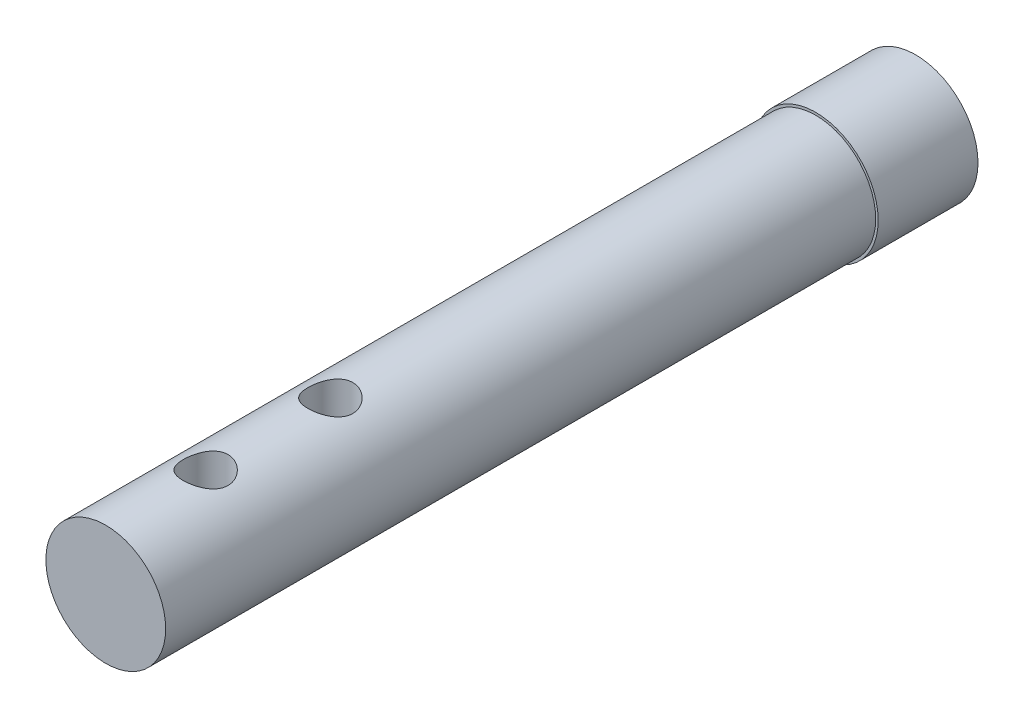
ISO-10303-21;
HEADER;
FILE_DESCRIPTION(('STEP AP214'),'2;1');
FILE_NAME('part.step','',(''),(''),'','','');
FILE_SCHEMA(('AUTOMOTIVE_DESIGN { 1 0 10303 214 1 1 1 1 }'));
ENDSEC;
DATA;
#1=APPLICATION_CONTEXT('core data for automotive mechanical design processes');
#2=APPLICATION_PROTOCOL_DEFINITION('international standard','automotive_design',2000,#1);
#3=PRODUCT_CONTEXT('',#1,'mechanical');
#4=PRODUCT('Part','Part','',(#3));
#5=PRODUCT_RELATED_PRODUCT_CATEGORY('part','',(#4));
#6=PRODUCT_DEFINITION_FORMATION('','',#4);
#7=PRODUCT_DEFINITION_CONTEXT('part definition',#1,'design');
#8=PRODUCT_DEFINITION('design','',#6,#7);
#9=PRODUCT_DEFINITION_SHAPE('','',#8);
#10=(LENGTH_UNIT() NAMED_UNIT(*) SI_UNIT(.MILLI.,.METRE.));
#11=(NAMED_UNIT(*) PLANE_ANGLE_UNIT() SI_UNIT($,.RADIAN.));
#12=(NAMED_UNIT(*) SI_UNIT($,.STERADIAN.) SOLID_ANGLE_UNIT());
#13=UNCERTAINTY_MEASURE_WITH_UNIT(LENGTH_MEASURE(1.E-05),#10,'distance_accuracy_value','');
#14=(GEOMETRIC_REPRESENTATION_CONTEXT(3) GLOBAL_UNCERTAINTY_ASSIGNED_CONTEXT((#13)) GLOBAL_UNIT_ASSIGNED_CONTEXT((#10,
#11,#12)) REPRESENTATION_CONTEXT('',''));
#15=CARTESIAN_POINT('',(0.,0.,0.));
#16=DIRECTION('',(0.,0.,1.));
#17=DIRECTION('',(1.,0.,0.));
#18=AXIS2_PLACEMENT_3D('',#15,#16,#17);
#19=CARTESIAN_POINT('',(0.,0.,35.));
#20=DIRECTION('',(0.,0.,-1.));
#21=DIRECTION('',(-1.,0.,0.));
#22=AXIS2_PLACEMENT_3D('',#19,#20,#21);
#23=CYLINDRICAL_SURFACE('',#22,12.5);
#24=CARTESIAN_POINT('',(0.,0.,35.));
#25=DIRECTION('',(0.,0.,1.));
#26=DIRECTION('',(1.,0.,0.));
#27=AXIS2_PLACEMENT_3D('',#24,#25,#26);
#28=CIRCLE('',#27,12.5);
#29=CARTESIAN_POINT('',(12.5,0.,35.));
#30=VERTEX_POINT('',#29);
#31=EDGE_CURVE('E43',#30,#30,#28,.T.);
#32=ORIENTED_EDGE('',*,*,#31,.F.);
#33=EDGE_LOOP('',(#32));
#34=FACE_BOUND('',#33,.T.);
#35=CARTESIAN_POINT('',(0.,0.,15.));
#36=DIRECTION('',(0.,0.,1.));
#37=DIRECTION('',(1.,0.,0.));
#38=AXIS2_PLACEMENT_3D('',#35,#36,#37);
#39=CIRCLE('',#38,12.5);
#40=CARTESIAN_POINT('',(12.5,0.,15.));
#41=VERTEX_POINT('',#40);
#42=EDGE_CURVE('E48',#41,#41,#39,.T.);
#43=ORIENTED_EDGE('',*,*,#42,.T.);
#44=EDGE_LOOP('',(#43));
#45=FACE_BOUND('',#44,.T.);
#46=ADVANCED_FACE('F31',(#34,#45),#23,.T.);
#47=CARTESIAN_POINT('',(0.,0.,35.));
#48=DIRECTION('',(0.,0.,1.));
#49=DIRECTION('',(1.,0.,0.));
#50=AXIS2_PLACEMENT_3D('',#47,#48,#49);
#51=PLANE('',#50);
#52=CARTESIAN_POINT('',(0.,0.,35.));
#53=DIRECTION('',(0.,0.,1.));
#54=DIRECTION('',(1.,0.,0.));
#55=AXIS2_PLACEMENT_3D('',#52,#53,#54);
#56=CIRCLE('',#55,12.);
#57=CARTESIAN_POINT('',(12.,0.,35.));
#58=VERTEX_POINT('',#57);
#59=EDGE_CURVE('E10',#58,#58,#56,.T.);
#60=ORIENTED_EDGE('',*,*,#59,.F.);
#61=EDGE_LOOP('',(#60));
#62=FACE_BOUND('',#61,.T.);
#63=ORIENTED_EDGE('',*,*,#31,.T.);
#64=EDGE_LOOP('',(#63));
#65=FACE_BOUND('',#64,.T.);
#66=ADVANCED_FACE('F87',(#62,#65),#51,.T.);
#67=CARTESIAN_POINT('',(0.,0.,15.));
#68=DIRECTION('',(0.,0.,1.));
#69=DIRECTION('',(1.,0.,0.));
#70=AXIS2_PLACEMENT_3D('',#67,#68,#69);
#71=PLANE('',#70);
#72=ORIENTED_EDGE('',*,*,#42,.F.);
#73=EDGE_LOOP('',(#72));
#74=FACE_BOUND('',#73,.T.);
#75=ADVANCED_FACE('F83',(#74),#71,.F.);
#76=CARTESIAN_POINT('',(0.,0.,177.26));
#77=DIRECTION('',(0.,0.,-1.));
#78=DIRECTION('',(-1.,0.,0.));
#79=AXIS2_PLACEMENT_3D('',#76,#77,#78);
#80=CYLINDRICAL_SURFACE('',#79,12.);
#81=CARTESIAN_POINT('',(0.,-12.,136.76));
#82=CARTESIAN_POINT('',(0.121821920216141,-12.0000004149463,136.760000562589));
#83=CARTESIAN_POINT('',(0.243636002691335,-11.9981409348073,136.755049364538));
#84=CARTESIAN_POINT('',(0.486392423781216,-11.9907535477711,136.735293911887));
#85=CARTESIAN_POINT('',(0.607334471202253,-11.9852244680872,136.720486507286));
#86=CARTESIAN_POINT('',(0.84734738168719,-11.970649565472,136.681174413436));
#87=CARTESIAN_POINT('',(0.966419205128139,-11.9616056132673,136.656674882519));
#88=CARTESIAN_POINT('',(1.20195810401351,-11.9402382455256,136.59820576059));
#89=CARTESIAN_POINT('',(1.31842414848256,-11.9279135559973,136.564232490447));
#90=CARTESIAN_POINT('',(1.54765442429004,-11.9003384511568,136.487214849951));
#91=CARTESIAN_POINT('',(1.660426734491,-11.8850950009216,136.444192050998));
#92=CARTESIAN_POINT('',(1.88185705605878,-11.8520536393113,136.349393964957));
#93=CARTESIAN_POINT('',(1.99051352350808,-11.8342547811235,136.297615432482));
#94=CARTESIAN_POINT('',(2.30927279411985,-11.7776768093622,136.129731594457));
#95=CARTESIAN_POINT('',(2.51234231941558,-11.7356939966761,136.001018203868));
#96=CARTESIAN_POINT('',(2.90206977477989,-11.6455850212357,135.708156633399));
#97=CARTESIAN_POINT('',(3.08780172063125,-11.5972851945296,135.542840477992));
#98=CARTESIAN_POINT('',(3.42974311725175,-11.500801507554,135.183737421702));
#99=CARTESIAN_POINT('',(3.58594353155377,-11.4526176872201,134.989941838426));
#100=CARTESIAN_POINT('',(3.79764477617944,-11.3834841407686,134.677559070828));
#101=CARTESIAN_POINT('',(3.86547493196535,-11.3605705131175,134.567562616254));
#102=CARTESIAN_POINT('',(3.99157408188856,-11.3168804194774,134.341831512047));
#103=CARTESIAN_POINT('',(4.04984690983616,-11.2961030977882,134.226099187672));
#104=CARTESIAN_POINT('',(4.15634309619244,-11.257354412399,133.989634242611));
#105=CARTESIAN_POINT('',(4.20456527896397,-11.2393833770156,133.868901038945));
#106=CARTESIAN_POINT('',(4.29047551547084,-11.2068698048304,133.623350953977));
#107=CARTESIAN_POINT('',(4.32816865016454,-11.1923256148824,133.498536074949));
#108=CARTESIAN_POINT('',(4.3913383306389,-11.167687799886,133.250864282486));
#109=CARTESIAN_POINT('',(4.41724869222401,-11.1574374723367,133.128133574559));
#110=CARTESIAN_POINT('',(4.45874705417236,-11.1409189584307,132.880724885637));
#111=CARTESIAN_POINT('',(4.47433956871922,-11.1346490306496,132.756047780687));
#112=CARTESIAN_POINT('',(4.49504192825722,-11.1263077224061,132.505703904304));
#113=CARTESIAN_POINT('',(4.50015334189904,-11.124235713664,132.380037283793));
#114=CARTESIAN_POINT('',(4.4998396408155,-11.124362586323,132.128723898627));
#115=CARTESIAN_POINT('',(4.49441493477359,-11.1265613020677,132.00307713339));
#116=CARTESIAN_POINT('',(4.47373138181252,-11.1348931002806,131.760345583509));
#117=CARTESIAN_POINT('',(4.45908334347361,-11.1407817124043,131.643200175152));
#118=CARTESIAN_POINT('',(4.42068867776497,-11.1560711786316,131.410631735769));
#119=CARTESIAN_POINT('',(4.39693902815624,-11.1654731993557,131.295209290103));
#120=CARTESIAN_POINT('',(4.31234407385654,-11.1985472030748,130.952770983111));
#121=CARTESIAN_POINT('',(4.23813423625877,-11.2270952052095,130.729371280221));
#122=CARTESIAN_POINT('',(4.05490721343478,-11.294571324263,130.294132319446));
#123=CARTESIAN_POINT('',(3.94525805379047,-11.3336856090865,130.08259174478));
#124=CARTESIAN_POINT('',(3.69468362169031,-11.417826234714,129.680172587469));
#125=CARTESIAN_POINT('',(3.55374755073013,-11.4628546145386,129.489301172593));
#126=CARTESIAN_POINT('',(3.23345300799872,-11.5574411862383,129.120186122089));
#127=CARTESIAN_POINT('',(3.05214885027355,-11.607100429164,128.94365330368));
#128=CARTESIAN_POINT('',(2.66193788370924,-11.7027518394278,128.622986875577));
#129=CARTESIAN_POINT('',(2.45302684040981,-11.7487434424691,128.478858245353));
#130=CARTESIAN_POINT('',(2.00917028059687,-11.8327918458053,128.225208596408));
#131=CARTESIAN_POINT('',(1.77387213379261,-11.8707149483013,128.116257198474));
#132=CARTESIAN_POINT('',(1.28651055931183,-11.9333615492963,127.940052245027));
#133=CARTESIAN_POINT('',(1.03445463312943,-11.9580909097264,127.8727801694));
#134=CARTESIAN_POINT('',(0.535125728885333,-11.9905332973328,127.785131619306));
#135=CARTESIAN_POINT('',(0.288310863440802,-11.9990810722223,127.762452162351));
#136=CARTESIAN_POINT('',(-0.205717430518205,-12.0007768095524,127.757926826798));
#137=CARTESIAN_POINT('',(-0.452930758520928,-11.9939281862917,127.776071894972));
#138=CARTESIAN_POINT('',(-0.930786126866782,-11.9661512982893,127.850930073153));
#139=CARTESIAN_POINT('',(-1.16169991458787,-11.9457741475744,127.906134437354));
#140=CARTESIAN_POINT('',(-1.61082533431484,-11.8935442940439,128.051558411525));
#141=CARTESIAN_POINT('',(-1.82903531000968,-11.8616900987367,128.141782575637));
#142=CARTESIAN_POINT('',(-2.25374302875422,-11.7884888040033,128.357558494317));
#143=CARTESIAN_POINT('',(-2.45970824228689,-11.7468902777666,128.484070377444));
#144=CARTESIAN_POINT('',(-2.8481791439392,-11.6587998753534,128.76775712078));
#145=CARTESIAN_POINT('',(-3.03067612982123,-11.6123061955645,128.924943301224));
#146=CARTESIAN_POINT('',(-3.37808840855275,-11.516200958323,129.276201253386));
#147=CARTESIAN_POINT('',(-3.54136933947529,-11.4665650100461,129.471883953797));
#148=CARTESIAN_POINT('',(-3.8331467865608,-11.372360357102,129.888996752467));
#149=CARTESIAN_POINT('',(-3.96164017919756,-11.3277921076647,130.110429160208));
#150=CARTESIAN_POINT('',(-4.12541953452076,-11.2687303690453,130.457922796397));
#151=CARTESIAN_POINT('',(-4.17527938653559,-11.2503030894951,130.576647329586));
#152=CARTESIAN_POINT('',(-4.26475585416723,-11.2166905930926,130.818323845116));
#153=CARTESIAN_POINT('',(-4.30437682733462,-11.2015039975232,130.941274003754));
#154=CARTESIAN_POINT('',(-4.37296242168506,-11.1749073223601,131.190466472104));
#155=CARTESIAN_POINT('',(-4.40193024471254,-11.163496108165,131.316707780413));
#156=CARTESIAN_POINT('',(-4.44890662829911,-11.1448585297206,131.57151813959));
#157=CARTESIAN_POINT('',(-4.46691595320739,-11.1376318736025,131.700087027466));
#158=CARTESIAN_POINT('',(-4.4909611175474,-11.1279568107625,131.950138338187));
#159=CARTESIAN_POINT('',(-4.4976937576826,-11.1252304971503,132.071543515748));
#160=CARTESIAN_POINT('',(-4.50131029580419,-11.1237678185175,132.314568299403));
#161=CARTESIAN_POINT('',(-4.49819087218451,-11.1250327991546,132.436187963996));
#162=CARTESIAN_POINT('',(-4.48213280066959,-11.131512007523,132.678611778483));
#163=CARTESIAN_POINT('',(-4.46919877710471,-11.1367243753675,132.799416285416));
#164=CARTESIAN_POINT('',(-4.4336489114592,-11.150924738849,133.039410101132));
#165=CARTESIAN_POINT('',(-4.41102942370239,-11.1599141561698,133.158598784262));
#166=CARTESIAN_POINT('',(-4.35718066722756,-11.1810458214159,133.390811506595));
#167=CARTESIAN_POINT('',(-4.32623979458421,-11.1930817833517,133.503912139277));
#168=CARTESIAN_POINT('',(-4.25575591081443,-11.220069483486,133.727056271898));
#169=CARTESIAN_POINT('',(-4.21620988547499,-11.23502224319,133.837098685333));
#170=CARTESIAN_POINT('',(-4.08512625929658,-11.2836374066331,134.161595505612));
#171=CARTESIAN_POINT('',(-3.98110253179987,-11.3210734609741,134.370592817196));
#172=CARTESIAN_POINT('',(-3.73655960136618,-11.4041928736043,134.779509886323));
#173=CARTESIAN_POINT('',(-3.59441315608531,-11.4502056852775,134.978379513829));
#174=CARTESIAN_POINT('',(-3.28000639093493,-11.5441926723435,135.350437563583));
#175=CARTESIAN_POINT('',(-3.10773650011229,-11.5921674673836,135.523617791262));
#176=CARTESIAN_POINT('',(-2.82485495768736,-11.6632064644304,135.765245875948));
#177=CARTESIAN_POINT('',(-2.72355677041139,-11.6873329442322,135.844523984934));
#178=CARTESIAN_POINT('',(-2.5143325103599,-11.7341212355869,135.994254321495));
#179=CARTESIAN_POINT('',(-2.40640888366377,-11.7567835814237,136.064709777492));
#180=CARTESIAN_POINT('',(-2.18454509687348,-11.8000231112314,136.196294134108));
#181=CARTESIAN_POINT('',(-2.0706017726869,-11.8205991816831,136.257418062869));
#182=CARTESIAN_POINT('',(-1.83755175113718,-11.8590616275344,136.369759993606));
#183=CARTESIAN_POINT('',(-1.71844727331547,-11.8769491446375,136.42098220304));
#184=CARTESIAN_POINT('',(-1.47053797162902,-11.9102407175975,136.515097964792));
#185=CARTESIAN_POINT('',(-1.34153686175291,-11.9255011706843,136.557526838323));
#186=CARTESIAN_POINT('',(-1.07989915577463,-11.9520331999052,136.630612963128));
#187=CARTESIAN_POINT('',(-0.947264179674959,-11.9633065233273,136.661275371348));
#188=CARTESIAN_POINT('',(-0.679492491904587,-11.9814979813589,136.710485060083));
#189=CARTESIAN_POINT('',(-0.544356226207077,-11.9884168847946,136.729034479318));
#190=CARTESIAN_POINT('',(-0.272809934790554,-11.9976674031164,136.753790938277));
#191=CARTESIAN_POINT('',(-0.136400054481803,-11.9999995353981,136.759999370088));
#192=CARTESIAN_POINT('',(0.,-12.,136.76));
#193=B_SPLINE_CURVE_WITH_KNOTS('',3,(#81,#82,#83,#84,#85,#86,#87,#88,#89,#90,#91,#92,#93,#94,
#95,#96,#97,#98,#99,#100,#101,#102,#103,#104,#105,#106,#107,#108,#109,#110,#111,#112,#113,#114,
#115,#116,#117,#118,#119,#120,#121,#122,#123,#124,#125,#126,#127,#128,#129,#130,#131,#132,#133,
#134,#135,#136,#137,#138,#139,#140,#141,#142,#143,#144,#145,#146,#147,#148,#149,#150,#151,#152,
#153,#154,#155,#156,#157,#158,#159,#160,#161,#162,#163,#164,#165,#166,#167,#168,#169,#170,#171,
#172,#173,#174,#175,#176,#177,#178,#179,#180,#181,#182,#183,#184,#185,#186,#187,#188,#189,#190,
#191,#192),.UNSPECIFIED.,.T.,.F.,(4,2,2,2,2,2,2,2,2,2,2,2,2,2,2,2,2,2,2,2,2,2,2,2,2,2,2,2,2,2,2,
2,2,2,2,2,2,2,2,2,2,2,2,2,2,2,2,2,2,2,2,2,2,2,2,4),(0.,0.365338024506953,0.730792865566527,
1.09605346575199,1.46145611308566,1.82599742407274,2.19067415273862,2.91947018392637,
3.67616860257938,4.43309819286657,4.82642681378567,5.21959726757261,5.6128136852447,
6.00584002102328,6.38291145568139,6.75981780772976,7.13666774608809,7.5135030671805,
7.86768402280125,8.22198268815959,8.92994647641833,9.65130458621122,10.3729120569284,
11.1430169346751,11.9132400717527,12.6953735931829,13.477159325566,14.2173829236784,
14.9574423863163,15.6690654723159,16.3807811322343,17.1134089903886,17.8463077351967,
18.6217279182704,19.3972177022049,19.7870381951626,20.1766925107005,20.5662296182681,
20.9557395527225,21.3201489316714,21.6846811837187,22.0490417862153,22.4135396573091,
22.7667469946614,23.1200782532196,23.8262105801188,24.5693581369517,25.3127422403355,
25.7049754844993,26.0970647789657,26.4893622558027,26.8814926686161,27.2908478409866,
27.7000233978563,28.1091266894863,28.5181838309154),.UNSPECIFIED.);
#194=CARTESIAN_POINT('',(0.,-12.,136.76));
#195=VERTEX_POINT('',#194);
#196=EDGE_CURVE('E34',#195,#195,#193,.T.);
#197=ORIENTED_EDGE('',*,*,#196,.T.);
#198=EDGE_LOOP('',(#197));
#199=FACE_BOUND('',#198,.T.);
#200=CARTESIAN_POINT('',(0.,12.,136.76));
#201=CARTESIAN_POINT('',(-0.121821920216148,12.0000004149463,136.760000562589));
#202=CARTESIAN_POINT('',(-0.243636002691342,11.9981409348073,136.755049364538));
#203=CARTESIAN_POINT('',(-0.486392423781223,11.9907535477711,136.735293911887));
#204=CARTESIAN_POINT('',(-0.60733447120226,11.9852244680872,136.720486507286));
#205=CARTESIAN_POINT('',(-0.847347381687195,11.970649565472,136.681174413436));
#206=CARTESIAN_POINT('',(-0.966419205128142,11.9616056132673,136.656674882519));
#207=CARTESIAN_POINT('',(-1.20195810401351,11.9402382455256,136.59820576059));
#208=CARTESIAN_POINT('',(-1.31842414848256,11.9279135559973,136.564232490447));
#209=CARTESIAN_POINT('',(-1.54765442429004,11.9003384511568,136.487214849951));
#210=CARTESIAN_POINT('',(-1.66042673449101,11.8850950009216,136.444192050998));
#211=CARTESIAN_POINT('',(-1.88185705605879,11.8520536393113,136.349393964957));
#212=CARTESIAN_POINT('',(-1.99051352350809,11.8342547811235,136.297615432482));
#213=CARTESIAN_POINT('',(-2.30927279411986,11.7776768093622,136.129731594457));
#214=CARTESIAN_POINT('',(-2.51234231941558,11.7356939966761,136.001018203868));
#215=CARTESIAN_POINT('',(-2.90206977477989,11.6455850212357,135.708156633399));
#216=CARTESIAN_POINT('',(-3.08780172063126,11.5972851945296,135.542840477992));
#217=CARTESIAN_POINT('',(-3.42974311725176,11.500801507554,135.183737421702));
#218=CARTESIAN_POINT('',(-3.58594353155377,11.4526176872201,134.989941838426));
#219=CARTESIAN_POINT('',(-3.79764477617945,11.3834841407686,134.677559070828));
#220=CARTESIAN_POINT('',(-3.86547493196536,11.3605705131175,134.567562616254));
#221=CARTESIAN_POINT('',(-3.99157408188856,11.3168804194774,134.341831512047));
#222=CARTESIAN_POINT('',(-4.04984690983617,11.2961030977882,134.226099187672));
#223=CARTESIAN_POINT('',(-4.15634309619245,11.257354412399,133.989634242611));
#224=CARTESIAN_POINT('',(-4.20456527896398,11.2393833770156,133.868901038945));
#225=CARTESIAN_POINT('',(-4.29047551547085,11.2068698048304,133.623350953977));
#226=CARTESIAN_POINT('',(-4.32816865016455,11.1923256148824,133.498536074949));
#227=CARTESIAN_POINT('',(-4.3913383306389,11.167687799886,133.250864282486));
#228=CARTESIAN_POINT('',(-4.41724869222402,11.1574374723367,133.128133574559));
#229=CARTESIAN_POINT('',(-4.45874705417237,11.1409189584307,132.880724885637));
#230=CARTESIAN_POINT('',(-4.47433956871923,11.1346490306496,132.756047780687));
#231=CARTESIAN_POINT('',(-4.49504192825722,11.1263077224061,132.505703904304));
#232=CARTESIAN_POINT('',(-4.50015334189905,11.124235713664,132.380037283793));
#233=CARTESIAN_POINT('',(-4.49983964081551,11.124362586323,132.128723898627));
#234=CARTESIAN_POINT('',(-4.4944149347736,11.1265613020677,132.00307713339));
#235=CARTESIAN_POINT('',(-4.47373138181252,11.1348931002806,131.760345583509));
#236=CARTESIAN_POINT('',(-4.45908334347362,11.1407817124043,131.643200175152));
#237=CARTESIAN_POINT('',(-4.42068867776498,11.1560711786316,131.410631735769));
#238=CARTESIAN_POINT('',(-4.39693902815624,11.1654731993557,131.295209290103));
#239=CARTESIAN_POINT('',(-4.31234407385655,11.1985472030748,130.952770983111));
#240=CARTESIAN_POINT('',(-4.23813423625877,11.2270952052095,130.729371280221));
#241=CARTESIAN_POINT('',(-4.05490721343479,11.294571324263,130.294132319446));
#242=CARTESIAN_POINT('',(-3.94525805379048,11.3336856090865,130.08259174478));
#243=CARTESIAN_POINT('',(-3.69468362169032,11.417826234714,129.680172587469));
#244=CARTESIAN_POINT('',(-3.55374755073014,11.4628546145386,129.489301172593));
#245=CARTESIAN_POINT('',(-3.23345300799872,11.5574411862383,129.120186122089));
#246=CARTESIAN_POINT('',(-3.05214885027355,11.607100429164,128.94365330368));
#247=CARTESIAN_POINT('',(-2.66193788370925,11.7027518394278,128.622986875577));
#248=CARTESIAN_POINT('',(-2.45302684040981,11.7487434424691,128.478858245353));
#249=CARTESIAN_POINT('',(-2.00917028059688,11.8327918458053,128.225208596408));
#250=CARTESIAN_POINT('',(-1.77387213379261,11.8707149483013,128.116257198474));
#251=CARTESIAN_POINT('',(-1.28651055931184,11.9333615492963,127.940052245027));
#252=CARTESIAN_POINT('',(-1.03445463312944,11.9580909097264,127.8727801694));
#253=CARTESIAN_POINT('',(-0.53512572888534,11.9905332973328,127.785131619306));
#254=CARTESIAN_POINT('',(-0.28831086344081,11.9990810722223,127.762452162351));
#255=CARTESIAN_POINT('',(0.205717430518197,12.0007768095524,127.757926826798));
#256=CARTESIAN_POINT('',(0.45293075852092,11.9939281862917,127.776071894972));
#257=CARTESIAN_POINT('',(0.930786126866774,11.9661512982893,127.850930073153));
#258=CARTESIAN_POINT('',(1.16169991458787,11.9457741475744,127.906134437354));
#259=CARTESIAN_POINT('',(1.61082533431484,11.8935442940439,128.051558411525));
#260=CARTESIAN_POINT('',(1.82903531000967,11.8616900987367,128.141782575637));
#261=CARTESIAN_POINT('',(2.25374302875422,11.7884888040033,128.357558494317));
#262=CARTESIAN_POINT('',(2.45970824228691,11.7468902777666,128.484070377444));
#263=CARTESIAN_POINT('',(2.84817914393921,11.6587998753534,128.76775712078));
#264=CARTESIAN_POINT('',(3.03067612982123,11.6123061955645,128.924943301224));
#265=CARTESIAN_POINT('',(3.37808840855274,11.516200958323,129.276201253386));
#266=CARTESIAN_POINT('',(3.54136933947528,11.4665650100462,129.471883953797));
#267=CARTESIAN_POINT('',(3.8331467865608,11.372360357102,129.888996752467));
#268=CARTESIAN_POINT('',(3.96164017919755,11.3277921076647,130.110429160208));
#269=CARTESIAN_POINT('',(4.12541953452075,11.2687303690453,130.457922796397));
#270=CARTESIAN_POINT('',(4.17527938653558,11.2503030894951,130.576647329586));
#271=CARTESIAN_POINT('',(4.26475585416721,11.2166905930926,130.818323845116));
#272=CARTESIAN_POINT('',(4.3043768273346,11.2015039975232,130.941274003754));
#273=CARTESIAN_POINT('',(4.37296242168504,11.1749073223601,131.190466472104));
#274=CARTESIAN_POINT('',(4.40193024471253,11.163496108165,131.316707780413));
#275=CARTESIAN_POINT('',(4.44890662829911,11.1448585297206,131.57151813959));
#276=CARTESIAN_POINT('',(4.46691595320738,11.1376318736025,131.700087027466));
#277=CARTESIAN_POINT('',(4.49096111754739,11.1279568107625,131.950138338187));
#278=CARTESIAN_POINT('',(4.49769375768259,11.1252304971503,132.071543515748));
#279=CARTESIAN_POINT('',(4.50131029580418,11.1237678185175,132.314568299403));
#280=CARTESIAN_POINT('',(4.4981908721845,11.1250327991546,132.436187963996));
#281=CARTESIAN_POINT('',(4.48213280066958,11.131512007523,132.678611778483));
#282=CARTESIAN_POINT('',(4.46919877710471,11.1367243753675,132.799416285416));
#283=CARTESIAN_POINT('',(4.4336489114592,11.150924738849,133.039410101132));
#284=CARTESIAN_POINT('',(4.41102942370238,11.1599141561698,133.158598784262));
#285=CARTESIAN_POINT('',(4.35718066722755,11.1810458214159,133.390811506595));
#286=CARTESIAN_POINT('',(4.3262397945842,11.1930817833517,133.503912139277));
#287=CARTESIAN_POINT('',(4.25575591081442,11.220069483486,133.727056271898));
#288=CARTESIAN_POINT('',(4.21620988547499,11.23502224319,133.837098685333));
#289=CARTESIAN_POINT('',(4.08512625929658,11.2836374066331,134.161595505612));
#290=CARTESIAN_POINT('',(3.98110253179987,11.3210734609741,134.370592817196));
#291=CARTESIAN_POINT('',(3.73655960136618,11.4041928736043,134.779509886323));
#292=CARTESIAN_POINT('',(3.5944131560853,11.4502056852775,134.978379513829));
#293=CARTESIAN_POINT('',(3.28000639093493,11.5441926723435,135.350437563583));
#294=CARTESIAN_POINT('',(3.10773650011228,11.5921674673836,135.523617791262));
#295=CARTESIAN_POINT('',(2.82485495768736,11.6632064644304,135.765245875948));
#296=CARTESIAN_POINT('',(2.72355677041138,11.6873329442322,135.844523984934));
#297=CARTESIAN_POINT('',(2.51433251035989,11.7341212355869,135.994254321495));
#298=CARTESIAN_POINT('',(2.40640888366376,11.7567835814237,136.064709777492));
#299=CARTESIAN_POINT('',(2.18454509687347,11.8000231112314,136.196294134108));
#300=CARTESIAN_POINT('',(2.0706017726869,11.8205991816831,136.257418062869));
#301=CARTESIAN_POINT('',(1.83755175113717,11.8590616275344,136.369759993606));
#302=CARTESIAN_POINT('',(1.71844727331546,11.8769491446375,136.42098220304));
#303=CARTESIAN_POINT('',(1.47053797162901,11.9102407175975,136.515097964792));
#304=CARTESIAN_POINT('',(1.3415368617529,11.9255011706843,136.557526838323));
#305=CARTESIAN_POINT('',(1.07989915577463,11.9520331999052,136.630612963128));
#306=CARTESIAN_POINT('',(0.947264179674952,11.9633065233273,136.661275371348));
#307=CARTESIAN_POINT('',(0.67949249190458,11.9814979813589,136.710485060083));
#308=CARTESIAN_POINT('',(0.54435622620707,11.9884168847946,136.729034479318));
#309=CARTESIAN_POINT('',(0.272809934790547,11.9976674031164,136.753790938277));
#310=CARTESIAN_POINT('',(0.136400054481796,11.9999995353981,136.759999370088));
#311=CARTESIAN_POINT('',(0.,12.,136.76));
#312=B_SPLINE_CURVE_WITH_KNOTS('',3,(#200,#201,#202,#203,#204,#205,#206,#207,#208,#209,#210,
#211,#212,#213,#214,#215,#216,#217,#218,#219,#220,#221,#222,#223,#224,#225,#226,#227,#228,#229,
#230,#231,#232,#233,#234,#235,#236,#237,#238,#239,#240,#241,#242,#243,#244,#245,#246,#247,#248,
#249,#250,#251,#252,#253,#254,#255,#256,#257,#258,#259,#260,#261,#262,#263,#264,#265,#266,#267,
#268,#269,#270,#271,#272,#273,#274,#275,#276,#277,#278,#279,#280,#281,#282,#283,#284,#285,#286,
#287,#288,#289,#290,#291,#292,#293,#294,#295,#296,#297,#298,#299,#300,#301,#302,#303,#304,#305,
#306,#307,#308,#309,#310,#311),.UNSPECIFIED.,.T.,.F.,(4,2,2,2,2,2,2,2,2,2,2,2,2,2,2,2,2,2,2,2,2,
2,2,2,2,2,2,2,2,2,2,2,2,2,2,2,2,2,2,2,2,2,2,2,2,2,2,2,2,2,2,2,2,2,2,4),(0.,0.365338024506954,
0.730792865566528,1.09605346575198,1.46145611308566,1.82599742407274,2.19067415273862,
2.91947018392637,3.67616860257938,4.43309819286657,4.82642681378567,5.21959726757261,
5.6128136852447,6.00584002102328,6.38291145568139,6.75981780772976,7.13666774608809,
7.5135030671805,7.86768402280125,8.22198268815959,8.92994647641833,9.65130458621122,
10.3729120569284,11.1430169346751,11.9132400717527,12.6953735931829,13.477159325566,
14.2173829236784,14.9574423863163,15.6690654723159,16.3807811322343,17.1134089903887,
17.8463077351967,18.6217279182704,19.3972177022049,19.7870381951626,20.1766925107004,
20.5662296182681,20.9557395527225,21.3201489316714,21.6846811837187,22.0490417862153,
22.4135396573091,22.7667469946614,23.1200782532196,23.8262105801188,24.5693581369517,
25.3127422403355,25.7049754844993,26.0970647789657,26.4893622558027,26.8814926686162,
27.2908478409866,27.7000233978563,28.1091266894863,28.5181838309154),.UNSPECIFIED.);
#313=CARTESIAN_POINT('',(0.,12.,136.76));
#314=VERTEX_POINT('',#313);
#315=EDGE_CURVE('E144',#314,#314,#312,.T.);
#316=ORIENTED_EDGE('',*,*,#315,.T.);
#317=EDGE_LOOP('',(#316));
#318=FACE_BOUND('',#317,.T.);
#319=CARTESIAN_POINT('',(0.,-12.,161.76));
#320=CARTESIAN_POINT('',(0.121821920216141,-12.0000004149463,161.760000562589));
#321=CARTESIAN_POINT('',(0.243636002691335,-11.9981409348073,161.755049364538));
#322=CARTESIAN_POINT('',(0.486392423781216,-11.9907535477711,161.735293911887));
#323=CARTESIAN_POINT('',(0.607334471202253,-11.9852244680872,161.720486507286));
#324=CARTESIAN_POINT('',(0.84734738168719,-11.970649565472,161.681174413436));
#325=CARTESIAN_POINT('',(0.966419205128139,-11.9616056132673,161.656674882519));
#326=CARTESIAN_POINT('',(1.20195810401351,-11.9402382455256,161.59820576059));
#327=CARTESIAN_POINT('',(1.31842414848256,-11.9279135559973,161.564232490447));
#328=CARTESIAN_POINT('',(1.54765442429003,-11.9003384511568,161.487214849951));
#329=CARTESIAN_POINT('',(1.660426734491,-11.8850950009216,161.444192050998));
#330=CARTESIAN_POINT('',(1.88185705605878,-11.8520536393113,161.349393964957));
#331=CARTESIAN_POINT('',(1.99051352350808,-11.8342547811235,161.297615432482));
#332=CARTESIAN_POINT('',(2.30927279411985,-11.7776768093622,161.129731594457));
#333=CARTESIAN_POINT('',(2.51234231941558,-11.7356939966761,161.001018203868));
#334=CARTESIAN_POINT('',(2.90206977477989,-11.6455850212357,160.708156633399));
#335=CARTESIAN_POINT('',(3.08780172063126,-11.5972851945296,160.542840477992));
#336=CARTESIAN_POINT('',(3.42974311725176,-11.500801507554,160.183737421702));
#337=CARTESIAN_POINT('',(3.58594353155377,-11.4526176872201,159.989941838426));
#338=CARTESIAN_POINT('',(3.79764477617944,-11.3834841407686,159.677559070828));
#339=CARTESIAN_POINT('',(3.86547493196534,-11.3605705131175,159.567562616254));
#340=CARTESIAN_POINT('',(3.99157408188855,-11.3168804194774,159.341831512047));
#341=CARTESIAN_POINT('',(4.04984690983615,-11.2961030977882,159.226099187672));
#342=CARTESIAN_POINT('',(4.15634309619243,-11.2573544123991,158.989634242611));
#343=CARTESIAN_POINT('',(4.20456527896396,-11.2393833770156,158.868901038945));
#344=CARTESIAN_POINT('',(4.29047551547084,-11.2068698048304,158.623350953977));
#345=CARTESIAN_POINT('',(4.32816865016454,-11.1923256148824,158.498536074949));
#346=CARTESIAN_POINT('',(4.39133833063889,-11.167687799886,158.250864282486));
#347=CARTESIAN_POINT('',(4.41724869222401,-11.1574374723367,158.128133574559));
#348=CARTESIAN_POINT('',(4.45874705417236,-11.1409189584307,157.880724885637));
#349=CARTESIAN_POINT('',(4.47433956871922,-11.1346490306496,157.756047780687));
#350=CARTESIAN_POINT('',(4.49504192825721,-11.1263077224061,157.505703904304));
#351=CARTESIAN_POINT('',(4.50015334189904,-11.124235713664,157.380037283793));
#352=CARTESIAN_POINT('',(4.4998396408155,-11.124362586323,157.128723898627));
#353=CARTESIAN_POINT('',(4.49441493477359,-11.1265613020677,157.00307713339));
#354=CARTESIAN_POINT('',(4.47373138181252,-11.1348931002806,156.760345583509));
#355=CARTESIAN_POINT('',(4.45908334347361,-11.1407817124043,156.643200175152));
#356=CARTESIAN_POINT('',(4.42068867776497,-11.1560711786316,156.410631735769));
#357=CARTESIAN_POINT('',(4.39693902815624,-11.1654731993557,156.295209290103));
#358=CARTESIAN_POINT('',(4.31234407385654,-11.1985472030748,155.952770983111));
#359=CARTESIAN_POINT('',(4.23813423625877,-11.2270952052095,155.729371280221));
#360=CARTESIAN_POINT('',(4.05490721343479,-11.294571324263,155.294132319446));
#361=CARTESIAN_POINT('',(3.94525805379047,-11.3336856090865,155.08259174478));
#362=CARTESIAN_POINT('',(3.69468362169031,-11.417826234714,154.680172587469));
#363=CARTESIAN_POINT('',(3.55374755073013,-11.4628546145386,154.489301172593));
#364=CARTESIAN_POINT('',(3.23345300799871,-11.5574411862383,154.120186122089));
#365=CARTESIAN_POINT('',(3.05214885027354,-11.607100429164,153.94365330368));
#366=CARTESIAN_POINT('',(2.66193788370923,-11.7027518394278,153.622986875577));
#367=CARTESIAN_POINT('',(2.4530268404098,-11.7487434424691,153.478858245353));
#368=CARTESIAN_POINT('',(2.00917028059687,-11.8327918458053,153.225208596408));
#369=CARTESIAN_POINT('',(1.77387213379261,-11.8707149483013,153.116257198474));
#370=CARTESIAN_POINT('',(1.28651055931184,-11.9333615492963,152.940052245027));
#371=CARTESIAN_POINT('',(1.03445463312944,-11.9580909097264,152.8727801694));
#372=CARTESIAN_POINT('',(0.535125728885332,-11.9905332973328,152.785131619306));
#373=CARTESIAN_POINT('',(0.288310863440802,-11.9990810722223,152.762452162351));
#374=CARTESIAN_POINT('',(-0.205717430518205,-12.0007768095524,152.757926826798));
#375=CARTESIAN_POINT('',(-0.452930758520928,-11.9939281862917,152.776071894972));
#376=CARTESIAN_POINT('',(-0.930786126866782,-11.9661512982893,152.850930073153));
#377=CARTESIAN_POINT('',(-1.16169991458787,-11.9457741475744,152.906134437354));
#378=CARTESIAN_POINT('',(-1.61082533431484,-11.8935442940439,153.051558411525));
#379=CARTESIAN_POINT('',(-1.82903531000967,-11.8616900987367,153.141782575637));
#380=CARTESIAN_POINT('',(-2.25374302875423,-11.7884888040033,153.357558494317));
#381=CARTESIAN_POINT('',(-2.4597082422869,-11.7468902777666,153.484070377444));
#382=CARTESIAN_POINT('',(-2.84817914393921,-11.6587998753534,153.76775712078));
#383=CARTESIAN_POINT('',(-3.03067612982124,-11.6123061955645,153.924943301224));
#384=CARTESIAN_POINT('',(-3.37808840855274,-11.516200958323,154.276201253386));
#385=CARTESIAN_POINT('',(-3.54136933947528,-11.4665650100462,154.471883953797));
#386=CARTESIAN_POINT('',(-3.83314678656079,-11.372360357102,154.888996752467));
#387=CARTESIAN_POINT('',(-3.96164017919756,-11.3277921076647,155.110429160208));
#388=CARTESIAN_POINT('',(-4.12541953452076,-11.2687303690453,155.457922796397));
#389=CARTESIAN_POINT('',(-4.17527938653559,-11.2503030894951,155.576647329586));
#390=CARTESIAN_POINT('',(-4.26475585416724,-11.2166905930926,155.818323845116));
#391=CARTESIAN_POINT('',(-4.30437682733463,-11.2015039975232,155.941274003754));
#392=CARTESIAN_POINT('',(-4.37296242168506,-11.1749073223601,156.190466472104));
#393=CARTESIAN_POINT('',(-4.40193024471255,-11.163496108165,156.316707780413));
#394=CARTESIAN_POINT('',(-4.44890662829911,-11.1448585297206,156.57151813959));
#395=CARTESIAN_POINT('',(-4.46691595320739,-11.1376318736025,156.700087027466));
#396=CARTESIAN_POINT('',(-4.4909611175474,-11.1279568107625,156.950138338187));
#397=CARTESIAN_POINT('',(-4.4976937576826,-11.1252304971503,157.071543515748));
#398=CARTESIAN_POINT('',(-4.50131029580419,-11.1237678185175,157.314568299403));
#399=CARTESIAN_POINT('',(-4.49819087218451,-11.1250327991546,157.436187963996));
#400=CARTESIAN_POINT('',(-4.48213280066959,-11.131512007523,157.678611778483));
#401=CARTESIAN_POINT('',(-4.46919877710471,-11.1367243753675,157.799416285416));
#402=CARTESIAN_POINT('',(-4.4336489114592,-11.150924738849,158.039410101132));
#403=CARTESIAN_POINT('',(-4.41102942370239,-11.1599141561698,158.158598784262));
#404=CARTESIAN_POINT('',(-4.35718066722756,-11.1810458214159,158.390811506595));
#405=CARTESIAN_POINT('',(-4.3262397945842,-11.1930817833517,158.503912139277));
#406=CARTESIAN_POINT('',(-4.25575591081442,-11.220069483486,158.727056271898));
#407=CARTESIAN_POINT('',(-4.21620988547499,-11.23502224319,158.837098685333));
#408=CARTESIAN_POINT('',(-4.08512625929658,-11.2836374066331,159.161595505612));
#409=CARTESIAN_POINT('',(-3.98110253179987,-11.3210734609741,159.370592817196));
#410=CARTESIAN_POINT('',(-3.73655960136618,-11.4041928736043,159.779509886323));
#411=CARTESIAN_POINT('',(-3.5944131560853,-11.4502056852775,159.978379513829));
#412=CARTESIAN_POINT('',(-3.28000639093493,-11.5441926723435,160.350437563583));
#413=CARTESIAN_POINT('',(-3.10773650011228,-11.5921674673836,160.523617791262));
#414=CARTESIAN_POINT('',(-2.82485495768736,-11.6632064644304,160.765245875948));
#415=CARTESIAN_POINT('',(-2.72355677041139,-11.6873329442322,160.844523984934));
#416=CARTESIAN_POINT('',(-2.5143325103599,-11.7341212355869,160.994254321495));
#417=CARTESIAN_POINT('',(-2.40640888366377,-11.7567835814237,161.064709777492));
#418=CARTESIAN_POINT('',(-2.18454509687348,-11.8000231112314,161.196294134108));
#419=CARTESIAN_POINT('',(-2.0706017726869,-11.8205991816831,161.257418062869));
#420=CARTESIAN_POINT('',(-1.83755175113717,-11.8590616275344,161.369759993606));
#421=CARTESIAN_POINT('',(-1.71844727331546,-11.8769491446375,161.42098220304));
#422=CARTESIAN_POINT('',(-1.47053797162902,-11.9102407175975,161.515097964792));
#423=CARTESIAN_POINT('',(-1.34153686175291,-11.9255011706843,161.557526838323));
#424=CARTESIAN_POINT('',(-1.07989915577463,-11.9520331999052,161.630612963128));
#425=CARTESIAN_POINT('',(-0.947264179674955,-11.9633065233273,161.661275371348));
#426=CARTESIAN_POINT('',(-0.679492491904584,-11.9814979813589,161.710485060083));
#427=CARTESIAN_POINT('',(-0.544356226207075,-11.9884168847946,161.729034479318));
#428=CARTESIAN_POINT('',(-0.272809934790553,-11.9976674031164,161.753790938277));
#429=CARTESIAN_POINT('',(-0.136400054481803,-11.9999995353981,161.759999370088));
#430=CARTESIAN_POINT('',(0.,-12.,161.76));
#431=B_SPLINE_CURVE_WITH_KNOTS('',3,(#319,#320,#321,#322,#323,#324,#325,#326,#327,#328,#329,
#330,#331,#332,#333,#334,#335,#336,#337,#338,#339,#340,#341,#342,#343,#344,#345,#346,#347,#348,
#349,#350,#351,#352,#353,#354,#355,#356,#357,#358,#359,#360,#361,#362,#363,#364,#365,#366,#367,
#368,#369,#370,#371,#372,#373,#374,#375,#376,#377,#378,#379,#380,#381,#382,#383,#384,#385,#386,
#387,#388,#389,#390,#391,#392,#393,#394,#395,#396,#397,#398,#399,#400,#401,#402,#403,#404,#405,
#406,#407,#408,#409,#410,#411,#412,#413,#414,#415,#416,#417,#418,#419,#420,#421,#422,#423,#424,
#425,#426,#427,#428,#429,#430),.UNSPECIFIED.,.T.,.F.,(4,2,2,2,2,2,2,2,2,2,2,2,2,2,2,2,2,2,2,2,2,
2,2,2,2,2,2,2,2,2,2,2,2,2,2,2,2,2,2,2,2,2,2,2,2,2,2,2,2,2,2,2,2,2,2,4),(0.,0.365338024506953,
0.730792865566527,1.09605346575199,1.46145611308566,1.82599742407273,2.19067415273862,
2.91947018392637,3.67616860257939,4.43309819286657,4.82642681378564,5.21959726757258,
5.61281368524467,6.00584002102328,6.38291145568136,6.75981780772973,7.13666774608807,
7.51350306718051,7.86768402280128,8.22198268815959,8.92994647641833,9.65130458621122,
10.3729120569284,11.1430169346751,11.9132400717527,12.6953735931829,13.477159325566,
14.2173829236784,14.9574423863163,15.6690654723159,16.3807811322343,17.1134089903886,
17.8463077351967,18.6217279182704,19.3972177022049,19.7870381951626,20.1766925107005,
20.5662296182681,20.9557395527225,21.3201489316714,21.6846811837187,22.0490417862154,
22.4135396573091,22.7667469946614,23.1200782532196,23.8262105801188,24.5693581369518,
25.3127422403355,25.7049754844993,26.0970647789657,26.4893622558027,26.8814926686161,
27.2908478409866,27.7000233978563,28.1091266894863,28.5181838309154),.UNSPECIFIED.);
#432=CARTESIAN_POINT('',(0.,-12.,161.76));
#433=VERTEX_POINT('',#432);
#434=EDGE_CURVE('E62',#433,#433,#431,.T.);
#435=ORIENTED_EDGE('',*,*,#434,.T.);
#436=EDGE_LOOP('',(#435));
#437=FACE_BOUND('',#436,.T.);
#438=CARTESIAN_POINT('',(0.,12.,161.76));
#439=CARTESIAN_POINT('',(-0.121821920216148,12.0000004149463,161.760000562589));
#440=CARTESIAN_POINT('',(-0.243636002691342,11.9981409348073,161.755049364538));
#441=CARTESIAN_POINT('',(-0.486392423781223,11.9907535477711,161.735293911887));
#442=CARTESIAN_POINT('',(-0.60733447120226,11.9852244680872,161.720486507286));
#443=CARTESIAN_POINT('',(-0.847347381687193,11.970649565472,161.681174413436));
#444=CARTESIAN_POINT('',(-0.966419205128137,11.9616056132673,161.656674882519));
#445=CARTESIAN_POINT('',(-1.2019581040135,11.9402382455256,161.59820576059));
#446=CARTESIAN_POINT('',(-1.31842414848256,11.9279135559973,161.564232490447));
#447=CARTESIAN_POINT('',(-1.54765442429005,11.9003384511568,161.487214849951));
#448=CARTESIAN_POINT('',(-1.66042673449102,11.8850950009216,161.444192050998));
#449=CARTESIAN_POINT('',(-1.8818570560588,11.8520536393113,161.349393964957));
#450=CARTESIAN_POINT('',(-1.99051352350809,11.8342547811235,161.297615432482));
#451=CARTESIAN_POINT('',(-2.30927279411986,11.7776768093622,161.129731594457));
#452=CARTESIAN_POINT('',(-2.51234231941558,11.7356939966761,161.001018203868));
#453=CARTESIAN_POINT('',(-2.9020697747799,11.6455850212357,160.708156633399));
#454=CARTESIAN_POINT('',(-3.08780172063127,11.5972851945296,160.542840477992));
#455=CARTESIAN_POINT('',(-3.42974311725177,11.500801507554,160.183737421702));
#456=CARTESIAN_POINT('',(-3.58594353155378,11.4526176872201,159.989941838426));
#457=CARTESIAN_POINT('',(-3.79764477617944,11.3834841407686,159.677559070828));
#458=CARTESIAN_POINT('',(-3.86547493196535,11.3605705131175,159.567562616254));
#459=CARTESIAN_POINT('',(-3.99157408188855,11.3168804194774,159.341831512047));
#460=CARTESIAN_POINT('',(-4.04984690983616,11.2961030977882,159.226099187672));
#461=CARTESIAN_POINT('',(-4.15634309619244,11.257354412399,158.989634242611));
#462=CARTESIAN_POINT('',(-4.20456527896397,11.2393833770156,158.868901038945));
#463=CARTESIAN_POINT('',(-4.29047551547084,11.2068698048304,158.623350953977));
#464=CARTESIAN_POINT('',(-4.32816865016454,11.1923256148824,158.498536074949));
#465=CARTESIAN_POINT('',(-4.3913383306389,11.167687799886,158.250864282486));
#466=CARTESIAN_POINT('',(-4.41724869222401,11.1574374723367,158.128133574559));
#467=CARTESIAN_POINT('',(-4.45874705417236,11.1409189584307,157.880724885637));
#468=CARTESIAN_POINT('',(-4.47433956871923,11.1346490306496,157.756047780687));
#469=CARTESIAN_POINT('',(-4.49504192825722,11.1263077224061,157.505703904304));
#470=CARTESIAN_POINT('',(-4.50015334189905,11.124235713664,157.380037283793));
#471=CARTESIAN_POINT('',(-4.49983964081551,11.124362586323,157.128723898627));
#472=CARTESIAN_POINT('',(-4.4944149347736,11.1265613020677,157.00307713339));
#473=CARTESIAN_POINT('',(-4.47373138181252,11.1348931002806,156.760345583509));
#474=CARTESIAN_POINT('',(-4.45908334347362,11.1407817124043,156.643200175152));
#475=CARTESIAN_POINT('',(-4.42068867776497,11.1560711786316,156.410631735769));
#476=CARTESIAN_POINT('',(-4.39693902815624,11.1654731993557,156.295209290103));
#477=CARTESIAN_POINT('',(-4.31234407385655,11.1985472030748,155.952770983111));
#478=CARTESIAN_POINT('',(-4.23813423625877,11.2270952052095,155.729371280221));
#479=CARTESIAN_POINT('',(-4.05490721343479,11.294571324263,155.294132319446));
#480=CARTESIAN_POINT('',(-3.94525805379048,11.3336856090865,155.08259174478));
#481=CARTESIAN_POINT('',(-3.69468362169032,11.417826234714,154.680172587469));
#482=CARTESIAN_POINT('',(-3.55374755073014,11.4628546145386,154.489301172593));
#483=CARTESIAN_POINT('',(-3.23345300799872,11.5574411862383,154.120186122089));
#484=CARTESIAN_POINT('',(-3.05214885027355,11.607100429164,153.94365330368));
#485=CARTESIAN_POINT('',(-2.66193788370924,11.7027518394278,153.622986875577));
#486=CARTESIAN_POINT('',(-2.45302684040981,11.7487434424691,153.478858245353));
#487=CARTESIAN_POINT('',(-2.00917028059688,11.8327918458053,153.225208596408));
#488=CARTESIAN_POINT('',(-1.77387213379261,11.8707149483013,153.116257198474));
#489=CARTESIAN_POINT('',(-1.28651055931184,11.9333615492963,152.940052245027));
#490=CARTESIAN_POINT('',(-1.03445463312944,11.9580909097264,152.8727801694));
#491=CARTESIAN_POINT('',(-0.53512572888534,11.9905332973328,152.785131619306));
#492=CARTESIAN_POINT('',(-0.28831086344081,11.9990810722223,152.762452162351));
#493=CARTESIAN_POINT('',(0.205717430518197,12.0007768095524,152.757926826798));
#494=CARTESIAN_POINT('',(0.45293075852092,11.9939281862917,152.776071894972));
#495=CARTESIAN_POINT('',(0.930786126866774,11.9661512982893,152.850930073153));
#496=CARTESIAN_POINT('',(1.16169991458787,11.9457741475744,152.906134437354));
#497=CARTESIAN_POINT('',(1.61082533431484,11.8935442940439,153.051558411525));
#498=CARTESIAN_POINT('',(1.82903531000967,11.8616900987367,153.141782575637));
#499=CARTESIAN_POINT('',(2.25374302875422,11.7884888040033,153.357558494317));
#500=CARTESIAN_POINT('',(2.45970824228691,11.7468902777666,153.484070377444));
#501=CARTESIAN_POINT('',(2.84817914393921,11.6587998753534,153.76775712078));
#502=CARTESIAN_POINT('',(3.03067612982124,11.6123061955645,153.924943301224));
#503=CARTESIAN_POINT('',(3.37808840855274,11.516200958323,154.276201253386));
#504=CARTESIAN_POINT('',(3.54136933947527,11.4665650100462,154.471883953797));
#505=CARTESIAN_POINT('',(3.83314678656079,11.372360357102,154.888996752467));
#506=CARTESIAN_POINT('',(3.96164017919755,11.3277921076647,155.110429160208));
#507=CARTESIAN_POINT('',(4.12541953452075,11.2687303690453,155.457922796397));
#508=CARTESIAN_POINT('',(4.17527938653557,11.2503030894951,155.576647329586));
#509=CARTESIAN_POINT('',(4.26475585416721,11.2166905930926,155.818323845116));
#510=CARTESIAN_POINT('',(4.3043768273346,11.2015039975232,155.941274003754));
#511=CARTESIAN_POINT('',(4.37296242168504,11.1749073223601,156.190466472104));
#512=CARTESIAN_POINT('',(4.40193024471253,11.163496108165,156.316707780413));
#513=CARTESIAN_POINT('',(4.44890662829911,11.1448585297206,156.57151813959));
#514=CARTESIAN_POINT('',(4.46691595320738,11.1376318736025,156.700087027466));
#515=CARTESIAN_POINT('',(4.49096111754739,11.1279568107625,156.950138338187));
#516=CARTESIAN_POINT('',(4.49769375768259,11.1252304971503,157.071543515748));
#517=CARTESIAN_POINT('',(4.50131029580418,11.1237678185175,157.314568299403));
#518=CARTESIAN_POINT('',(4.4981908721845,11.1250327991546,157.436187963996));
#519=CARTESIAN_POINT('',(4.48213280066958,11.131512007523,157.678611778483));
#520=CARTESIAN_POINT('',(4.4691987771047,11.1367243753675,157.799416285416));
#521=CARTESIAN_POINT('',(4.4336489114592,11.150924738849,158.039410101132));
#522=CARTESIAN_POINT('',(4.41102942370238,11.1599141561698,158.158598784262));
#523=CARTESIAN_POINT('',(4.35718066722755,11.1810458214159,158.390811506595));
#524=CARTESIAN_POINT('',(4.3262397945842,11.1930817833517,158.503912139277));
#525=CARTESIAN_POINT('',(4.25575591081442,11.220069483486,158.727056271898));
#526=CARTESIAN_POINT('',(4.21620988547498,11.23502224319,158.837098685333));
#527=CARTESIAN_POINT('',(4.08512625929657,11.2836374066331,159.161595505612));
#528=CARTESIAN_POINT('',(3.98110253179986,11.3210734609741,159.370592817196));
#529=CARTESIAN_POINT('',(3.73655960136617,11.4041928736043,159.779509886323));
#530=CARTESIAN_POINT('',(3.5944131560853,11.4502056852775,159.978379513829));
#531=CARTESIAN_POINT('',(3.28000639093492,11.5441926723436,160.350437563583));
#532=CARTESIAN_POINT('',(3.10773650011228,11.5921674673836,160.523617791262));
#533=CARTESIAN_POINT('',(2.82485495768735,11.6632064644304,160.765245875948));
#534=CARTESIAN_POINT('',(2.72355677041137,11.6873329442322,160.844523984934));
#535=CARTESIAN_POINT('',(2.51433251035988,11.7341212355869,160.994254321495));
#536=CARTESIAN_POINT('',(2.40640888366376,11.7567835814237,161.064709777492));
#537=CARTESIAN_POINT('',(2.18454509687347,11.8000231112314,161.196294134108));
#538=CARTESIAN_POINT('',(2.07060177268689,11.8205991816831,161.257418062869));
#539=CARTESIAN_POINT('',(1.83755175113716,11.8590616275344,161.369759993606));
#540=CARTESIAN_POINT('',(1.71844727331546,11.8769491446375,161.42098220304));
#541=CARTESIAN_POINT('',(1.47053797162901,11.9102407175975,161.515097964792));
#542=CARTESIAN_POINT('',(1.3415368617529,11.9255011706843,161.557526838323));
#543=CARTESIAN_POINT('',(1.07989915577462,11.9520331999052,161.630612963128));
#544=CARTESIAN_POINT('',(0.947264179674948,11.9633065233273,161.661275371348));
#545=CARTESIAN_POINT('',(0.679492491904575,11.9814979813589,161.710485060083));
#546=CARTESIAN_POINT('',(0.544356226207065,11.9884168847946,161.729034479318));
#547=CARTESIAN_POINT('',(0.272809934790544,11.9976674031164,161.753790938277));
#548=CARTESIAN_POINT('',(0.136400054481794,11.9999995353981,161.759999370088));
#549=CARTESIAN_POINT('',(0.,12.,161.76));
#550=B_SPLINE_CURVE_WITH_KNOTS('',3,(#438,#439,#440,#441,#442,#443,#444,#445,#446,#447,#448,
#449,#450,#451,#452,#453,#454,#455,#456,#457,#458,#459,#460,#461,#462,#463,#464,#465,#466,#467,
#468,#469,#470,#471,#472,#473,#474,#475,#476,#477,#478,#479,#480,#481,#482,#483,#484,#485,#486,
#487,#488,#489,#490,#491,#492,#493,#494,#495,#496,#497,#498,#499,#500,#501,#502,#503,#504,#505,
#506,#507,#508,#509,#510,#511,#512,#513,#514,#515,#516,#517,#518,#519,#520,#521,#522,#523,#524,
#525,#526,#527,#528,#529,#530,#531,#532,#533,#534,#535,#536,#537,#538,#539,#540,#541,#542,#543,
#544,#545,#546,#547,#548,#549),.UNSPECIFIED.,.T.,.F.,(4,2,2,2,2,2,2,2,2,2,2,2,2,2,2,2,2,2,2,2,2,
2,2,2,2,2,2,2,2,2,2,2,2,2,2,2,2,2,2,2,2,2,2,2,2,2,2,2,2,2,2,2,2,2,2,4),(0.,0.365338024506954,
0.730792865566528,1.09605346575197,1.46145611308566,1.82599742407275,2.19067415273862,
2.91947018392637,3.67616860257939,4.43309819286657,4.82642681378564,5.21959726757258,
5.61281368524467,6.00584002102328,6.38291145568136,6.75981780772973,7.13666774608807,
7.5135030671805,7.86768402280127,8.22198268815959,8.92994647641833,9.65130458621122,
10.3729120569284,11.1430169346751,11.9132400717527,12.6953735931829,13.477159325566,
14.2173829236784,14.9574423863163,15.6690654723159,16.3807811322343,17.1134089903887,
17.8463077351967,18.6217279182704,19.3972177022049,19.7870381951625,20.1766925107005,
20.5662296182681,20.9557395527225,21.3201489316714,21.6846811837187,22.0490417862154,
22.4135396573091,22.7667469946614,23.1200782532196,23.8262105801188,24.5693581369517,
25.3127422403355,25.7049754844993,26.0970647789657,26.4893622558027,26.8814926686161,
27.2908478409866,27.7000233978563,28.1091266894863,28.5181838309154),.UNSPECIFIED.);
#551=CARTESIAN_POINT('',(0.,12.,161.76));
#552=VERTEX_POINT('',#551);
#553=EDGE_CURVE('E55',#552,#552,#550,.T.);
#554=ORIENTED_EDGE('',*,*,#553,.T.);
#555=EDGE_LOOP('',(#554));
#556=FACE_BOUND('',#555,.T.);
#557=CARTESIAN_POINT('',(0.,0.,177.26));
#558=DIRECTION('',(0.,0.,1.));
#559=DIRECTION('',(1.,0.,0.));
#560=AXIS2_PLACEMENT_3D('',#557,#558,#559);
#561=CIRCLE('',#560,12.);
#562=CARTESIAN_POINT('',(12.,0.,177.26));
#563=VERTEX_POINT('',#562);
#564=EDGE_CURVE('E51',#563,#563,#561,.T.);
#565=ORIENTED_EDGE('',*,*,#564,.F.);
#566=EDGE_LOOP('',(#565));
#567=FACE_BOUND('',#566,.T.);
#568=ORIENTED_EDGE('',*,*,#59,.T.);
#569=EDGE_LOOP('',(#568));
#570=FACE_BOUND('',#569,.T.);
#571=ADVANCED_FACE('F66',(#199,#318,#437,#556,#567,#570),#80,.T.);
#572=CARTESIAN_POINT('',(0.,0.,177.26));
#573=DIRECTION('',(0.,0.,1.));
#574=DIRECTION('',(1.,0.,0.));
#575=AXIS2_PLACEMENT_3D('',#572,#573,#574);
#576=PLANE('',#575);
#577=ORIENTED_EDGE('',*,*,#564,.T.);
#578=EDGE_LOOP('',(#577));
#579=FACE_BOUND('',#578,.T.);
#580=ADVANCED_FACE('F74',(#579),#576,.T.);
#581=CARTESIAN_POINT('',(0.,-12.5,157.26));
#582=DIRECTION('',(0.,1.,0.));
#583=DIRECTION('',(0.,0.,1.));
#584=AXIS2_PLACEMENT_3D('',#581,#582,#583);
#585=CYLINDRICAL_SURFACE('',#584,4.50000000000001);
#586=ORIENTED_EDGE('',*,*,#553,.F.);
#587=EDGE_LOOP('',(#586));
#588=FACE_BOUND('',#587,.T.);
#589=ORIENTED_EDGE('',*,*,#434,.F.);
#590=EDGE_LOOP('',(#589));
#591=FACE_BOUND('',#590,.T.);
#592=ADVANCED_FACE('F70',(#588,#591),#585,.F.);
#593=CARTESIAN_POINT('',(0.,-12.5,132.26));
#594=DIRECTION('',(0.,1.,0.));
#595=DIRECTION('',(0.,0.,1.));
#596=AXIS2_PLACEMENT_3D('',#593,#594,#595);
#597=CYLINDRICAL_SURFACE('',#596,4.50000000000001);
#598=ORIENTED_EDGE('',*,*,#315,.F.);
#599=EDGE_LOOP('',(#598));
#600=FACE_BOUND('',#599,.T.);
#601=ORIENTED_EDGE('',*,*,#196,.F.);
#602=EDGE_LOOP('',(#601));
#603=FACE_BOUND('',#602,.T.);
#604=ADVANCED_FACE('F73',(#600,#603),#597,.F.);
#605=CLOSED_SHELL('',(#46,#66,#75,#571,#580,#592,#604));
#606=MANIFOLD_SOLID_BREP('B2',#605);
#607=ADVANCED_BREP_SHAPE_REPRESENTATION('',(#18,#606),#14);
#608=SHAPE_DEFINITION_REPRESENTATION(#9,#607);
ENDSEC;
END-ISO-10303-21;
